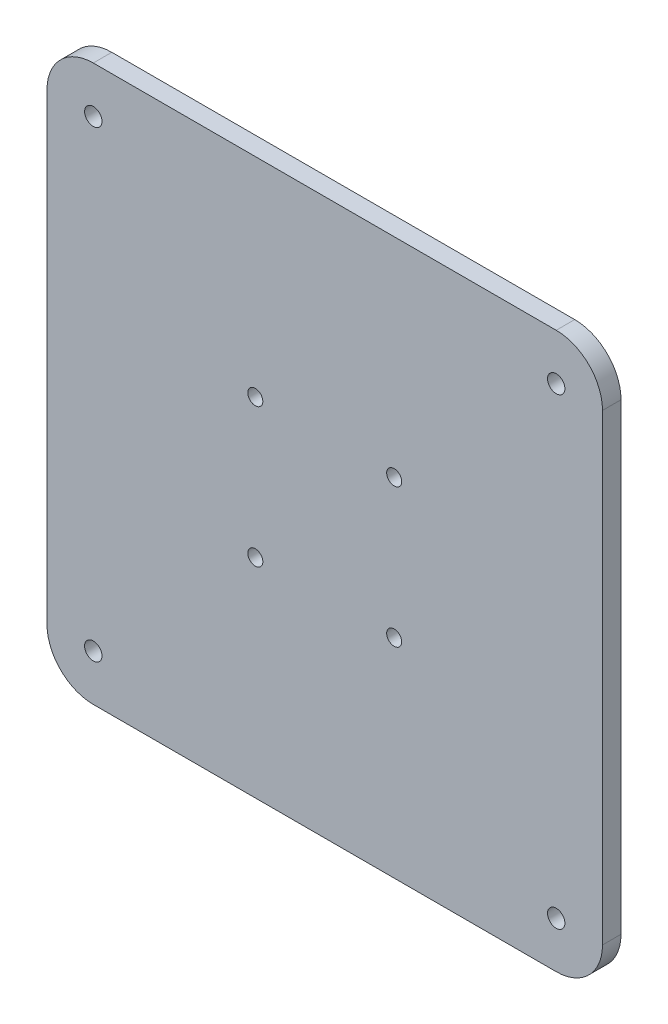
ISO-10303-21;
HEADER;
FILE_DESCRIPTION(('STEP AP214'),'2;1');
FILE_NAME('part.step','',(''),(''),'','','');
FILE_SCHEMA(('AUTOMOTIVE_DESIGN { 1 0 10303 214 1 1 1 1 }'));
ENDSEC;
DATA;
#1=APPLICATION_CONTEXT('core data for automotive mechanical design processes');
#2=APPLICATION_PROTOCOL_DEFINITION('international standard','automotive_design',2000,#1);
#3=PRODUCT_CONTEXT('',#1,'mechanical');
#4=PRODUCT('Part','Part','',(#3));
#5=PRODUCT_RELATED_PRODUCT_CATEGORY('part','',(#4));
#6=PRODUCT_DEFINITION_FORMATION('','',#4);
#7=PRODUCT_DEFINITION_CONTEXT('part definition',#1,'design');
#8=PRODUCT_DEFINITION('design','',#6,#7);
#9=PRODUCT_DEFINITION_SHAPE('','',#8);
#10=(LENGTH_UNIT() NAMED_UNIT(*) SI_UNIT(.MILLI.,.METRE.));
#11=(NAMED_UNIT(*) PLANE_ANGLE_UNIT() SI_UNIT($,.RADIAN.));
#12=(NAMED_UNIT(*) SI_UNIT($,.STERADIAN.) SOLID_ANGLE_UNIT());
#13=UNCERTAINTY_MEASURE_WITH_UNIT(LENGTH_MEASURE(1.E-05),#10,'distance_accuracy_value','');
#14=(GEOMETRIC_REPRESENTATION_CONTEXT(3) GLOBAL_UNCERTAINTY_ASSIGNED_CONTEXT((#13)) GLOBAL_UNIT_ASSIGNED_CONTEXT((#10,
#11,#12)) REPRESENTATION_CONTEXT('',''));
#15=CARTESIAN_POINT('',(0.,0.,0.));
#16=DIRECTION('',(0.,0.,1.));
#17=DIRECTION('',(1.,0.,0.));
#18=AXIS2_PLACEMENT_3D('',#15,#16,#17);
#19=CARTESIAN_POINT('',(0.,0.,8.));
#20=DIRECTION('',(0.,0.,-1.));
#21=DIRECTION('',(-1.,0.,0.));
#22=AXIS2_PLACEMENT_3D('',#19,#20,#21);
#23=PLANE('',#22);
#24=CARTESIAN_POINT('',(-100.,100.,8.));
#25=DIRECTION('',(0.,0.,-1.));
#26=DIRECTION('',(-1.,0.,0.));
#27=AXIS2_PLACEMENT_3D('',#24,#25,#26);
#28=CIRCLE('',#27,3.75000000000001);
#29=CARTESIAN_POINT('',(-103.75,100.,8.));
#30=VERTEX_POINT('',#29);
#31=EDGE_CURVE('E334',#30,#30,#28,.T.);
#32=ORIENTED_EDGE('',*,*,#31,.T.);
#33=EDGE_LOOP('',(#32));
#34=FACE_BOUND('',#33,.T.);
#35=CARTESIAN_POINT('',(100.,-100.,8.));
#36=DIRECTION('',(0.,0.,-1.));
#37=DIRECTION('',(-1.,0.,0.));
#38=AXIS2_PLACEMENT_3D('',#35,#36,#37);
#39=CIRCLE('',#38,3.75000000000001);
#40=CARTESIAN_POINT('',(96.25,-100.,8.));
#41=VERTEX_POINT('',#40);
#42=EDGE_CURVE('E322',#41,#41,#39,.T.);
#43=ORIENTED_EDGE('',*,*,#42,.T.);
#44=EDGE_LOOP('',(#43));
#45=FACE_BOUND('',#44,.T.);
#46=CARTESIAN_POINT('',(-30.,30.,8.));
#47=DIRECTION('',(0.,0.,-1.));
#48=DIRECTION('',(-1.,0.,0.));
#49=AXIS2_PLACEMENT_3D('',#46,#47,#48);
#50=CIRCLE('',#49,3.25000000000001);
#51=CARTESIAN_POINT('',(-33.25,30.,8.));
#52=VERTEX_POINT('',#51);
#53=EDGE_CURVE('E310',#52,#52,#50,.T.);
#54=ORIENTED_EDGE('',*,*,#53,.T.);
#55=EDGE_LOOP('',(#54));
#56=FACE_BOUND('',#55,.T.);
#57=CARTESIAN_POINT('',(30.,-30.,8.));
#58=DIRECTION('',(0.,0.,-1.));
#59=DIRECTION('',(-1.,0.,0.));
#60=AXIS2_PLACEMENT_3D('',#57,#58,#59);
#61=CIRCLE('',#60,3.25000000000001);
#62=CARTESIAN_POINT('',(26.75,-30.,8.));
#63=VERTEX_POINT('',#62);
#64=EDGE_CURVE('E298',#63,#63,#61,.T.);
#65=ORIENTED_EDGE('',*,*,#64,.T.);
#66=EDGE_LOOP('',(#65));
#67=FACE_BOUND('',#66,.T.);
#68=DIRECTION('',(1.,0.,0.));
#69=VECTOR('',#68,1.);
#70=CARTESIAN_POINT('',(-120.,120.,8.));
#71=LINE('',#70,#69);
#72=CARTESIAN_POINT('',(-100.,120.,8.));
#73=VERTEX_POINT('',#72);
#74=CARTESIAN_POINT('',(100.,120.,8.));
#75=VERTEX_POINT('',#74);
#76=EDGE_CURVE('E248',#73,#75,#71,.T.);
#77=ORIENTED_EDGE('',*,*,#76,.F.);
#78=CARTESIAN_POINT('',(-100.,100.,8.));
#79=DIRECTION('',(0.,0.,-1.));
#80=DIRECTION('',(-1.,0.,0.));
#81=AXIS2_PLACEMENT_3D('',#78,#79,#80);
#82=CIRCLE('',#81,20.);
#83=CARTESIAN_POINT('',(-120.,100.,8.));
#84=VERTEX_POINT('',#83);
#85=EDGE_CURVE('E272',#73,#84,#82,.F.);
#86=ORIENTED_EDGE('',*,*,#85,.T.);
#87=DIRECTION('',(0.,-1.,0.));
#88=VECTOR('',#87,1.);
#89=CARTESIAN_POINT('',(-120.,120.,8.));
#90=LINE('',#89,#88);
#91=CARTESIAN_POINT('',(-120.,-100.,8.));
#92=VERTEX_POINT('',#91);
#93=EDGE_CURVE('E241',#84,#92,#90,.T.);
#94=ORIENTED_EDGE('',*,*,#93,.T.);
#95=CARTESIAN_POINT('',(-100.,-100.,8.));
#96=DIRECTION('',(0.,0.,-1.));
#97=DIRECTION('',(-1.,0.,0.));
#98=AXIS2_PLACEMENT_3D('',#95,#96,#97);
#99=CIRCLE('',#98,20.);
#100=CARTESIAN_POINT('',(-100.,-120.,8.));
#101=VERTEX_POINT('',#100);
#102=EDGE_CURVE('E270',#92,#101,#99,.F.);
#103=ORIENTED_EDGE('',*,*,#102,.T.);
#104=DIRECTION('',(1.,0.,0.));
#105=VECTOR('',#104,1.);
#106=CARTESIAN_POINT('',(-120.,-120.,8.));
#107=LINE('',#106,#105);
#108=CARTESIAN_POINT('',(100.,-120.,8.));
#109=VERTEX_POINT('',#108);
#110=EDGE_CURVE('E283',#101,#109,#107,.T.);
#111=ORIENTED_EDGE('',*,*,#110,.T.);
#112=CARTESIAN_POINT('',(100.,-100.,8.));
#113=DIRECTION('',(0.,0.,-1.));
#114=DIRECTION('',(-1.,0.,0.));
#115=AXIS2_PLACEMENT_3D('',#112,#113,#114);
#116=CIRCLE('',#115,20.);
#117=CARTESIAN_POINT('',(120.,-100.,8.));
#118=VERTEX_POINT('',#117);
#119=EDGE_CURVE('E170',#109,#118,#116,.F.);
#120=ORIENTED_EDGE('',*,*,#119,.T.);
#121=DIRECTION('',(0.,-1.,0.));
#122=VECTOR('',#121,1.);
#123=CARTESIAN_POINT('',(120.,120.,8.));
#124=LINE('',#123,#122);
#125=CARTESIAN_POINT('',(120.,100.,8.));
#126=VERTEX_POINT('',#125);
#127=EDGE_CURVE('E252',#126,#118,#124,.T.);
#128=ORIENTED_EDGE('',*,*,#127,.F.);
#129=CARTESIAN_POINT('',(100.,100.,8.));
#130=DIRECTION('',(0.,0.,-1.));
#131=DIRECTION('',(-1.,0.,0.));
#132=AXIS2_PLACEMENT_3D('',#129,#130,#131);
#133=CIRCLE('',#132,20.);
#134=EDGE_CURVE('E267',#126,#75,#133,.F.);
#135=ORIENTED_EDGE('',*,*,#134,.T.);
#136=EDGE_LOOP('',(#77,#86,#94,#103,#111,#120,#128,#135));
#137=FACE_BOUND('',#136,.T.);
#138=CARTESIAN_POINT('',(-30.,-30.,8.));
#139=DIRECTION('',(0.,0.,1.));
#140=DIRECTION('',(1.,0.,0.));
#141=AXIS2_PLACEMENT_3D('',#138,#139,#140);
#142=CIRCLE('',#141,3.25000000000001);
#143=CARTESIAN_POINT('',(-26.75,-30.,8.));
#144=VERTEX_POINT('',#143);
#145=EDGE_CURVE('E305',#144,#144,#142,.T.);
#146=ORIENTED_EDGE('',*,*,#145,.F.);
#147=EDGE_LOOP('',(#146));
#148=FACE_BOUND('',#147,.T.);
#149=CARTESIAN_POINT('',(30.,30.,8.));
#150=DIRECTION('',(0.,0.,1.));
#151=DIRECTION('',(1.,0.,0.));
#152=AXIS2_PLACEMENT_3D('',#149,#150,#151);
#153=CIRCLE('',#152,3.25000000000001);
#154=CARTESIAN_POINT('',(33.25,30.,8.));
#155=VERTEX_POINT('',#154);
#156=EDGE_CURVE('E316',#155,#155,#153,.T.);
#157=ORIENTED_EDGE('',*,*,#156,.F.);
#158=EDGE_LOOP('',(#157));
#159=FACE_BOUND('',#158,.T.);
#160=CARTESIAN_POINT('',(-100.,-100.,8.));
#161=DIRECTION('',(0.,0.,1.));
#162=DIRECTION('',(1.,0.,0.));
#163=AXIS2_PLACEMENT_3D('',#160,#161,#162);
#164=CIRCLE('',#163,3.75000000000001);
#165=CARTESIAN_POINT('',(-96.25,-100.,8.));
#166=VERTEX_POINT('',#165);
#167=EDGE_CURVE('E328',#166,#166,#164,.T.);
#168=ORIENTED_EDGE('',*,*,#167,.F.);
#169=EDGE_LOOP('',(#168));
#170=FACE_BOUND('',#169,.T.);
#171=CARTESIAN_POINT('',(100.,100.,8.));
#172=DIRECTION('',(0.,0.,1.));
#173=DIRECTION('',(1.,0.,0.));
#174=AXIS2_PLACEMENT_3D('',#171,#172,#173);
#175=CIRCLE('',#174,3.75000000000001);
#176=CARTESIAN_POINT('',(103.75,100.,8.));
#177=VERTEX_POINT('',#176);
#178=EDGE_CURVE('E340',#177,#177,#175,.T.);
#179=ORIENTED_EDGE('',*,*,#178,.F.);
#180=EDGE_LOOP('',(#179));
#181=FACE_BOUND('',#180,.T.);
#182=ADVANCED_FACE('F155',(#34,#45,#56,#67,#137,#148,#159,#170,#181),#23,.F.);
#183=CARTESIAN_POINT('',(0.,0.,0.));
#184=DIRECTION('',(0.,0.,-1.));
#185=DIRECTION('',(-1.,0.,0.));
#186=AXIS2_PLACEMENT_3D('',#183,#184,#185);
#187=PLANE('',#186);
#188=CARTESIAN_POINT('',(-100.,-100.,0.));
#189=DIRECTION('',(0.,0.,1.));
#190=DIRECTION('',(1.,0.,0.));
#191=AXIS2_PLACEMENT_3D('',#188,#189,#190);
#192=CIRCLE('',#191,3.75000000000001);
#193=CARTESIAN_POINT('',(-96.25,-100.,0.));
#194=VERTEX_POINT('',#193);
#195=EDGE_CURVE('E331',#194,#194,#192,.T.);
#196=ORIENTED_EDGE('',*,*,#195,.T.);
#197=EDGE_LOOP('',(#196));
#198=FACE_BOUND('',#197,.T.);
#199=CARTESIAN_POINT('',(100.,-100.,0.));
#200=DIRECTION('',(0.,0.,-1.));
#201=DIRECTION('',(-1.,0.,0.));
#202=AXIS2_PLACEMENT_3D('',#199,#200,#201);
#203=CIRCLE('',#202,3.75000000000001);
#204=CARTESIAN_POINT('',(96.25,-100.,0.));
#205=VERTEX_POINT('',#204);
#206=EDGE_CURVE('E325',#205,#205,#203,.T.);
#207=ORIENTED_EDGE('',*,*,#206,.F.);
#208=EDGE_LOOP('',(#207));
#209=FACE_BOUND('',#208,.T.);
#210=CARTESIAN_POINT('',(-30.,-30.,0.));
#211=DIRECTION('',(0.,0.,1.));
#212=DIRECTION('',(1.,0.,0.));
#213=AXIS2_PLACEMENT_3D('',#210,#211,#212);
#214=CIRCLE('',#213,3.25000000000001);
#215=CARTESIAN_POINT('',(-26.75,-30.,0.));
#216=VERTEX_POINT('',#215);
#217=EDGE_CURVE('E307',#216,#216,#214,.T.);
#218=ORIENTED_EDGE('',*,*,#217,.T.);
#219=EDGE_LOOP('',(#218));
#220=FACE_BOUND('',#219,.T.);
#221=CARTESIAN_POINT('',(30.,-30.,0.));
#222=DIRECTION('',(0.,0.,-1.));
#223=DIRECTION('',(-1.,0.,0.));
#224=AXIS2_PLACEMENT_3D('',#221,#222,#223);
#225=CIRCLE('',#224,3.25000000000001);
#226=CARTESIAN_POINT('',(26.75,-30.,0.));
#227=VERTEX_POINT('',#226);
#228=EDGE_CURVE('E300',#227,#227,#225,.T.);
#229=ORIENTED_EDGE('',*,*,#228,.F.);
#230=EDGE_LOOP('',(#229));
#231=FACE_BOUND('',#230,.T.);
#232=DIRECTION('',(0.,-1.,0.));
#233=VECTOR('',#232,1.);
#234=CARTESIAN_POINT('',(-120.,120.,0.));
#235=LINE('',#234,#233);
#236=CARTESIAN_POINT('',(-120.,100.,0.));
#237=VERTEX_POINT('',#236);
#238=CARTESIAN_POINT('',(-120.,-100.,0.));
#239=VERTEX_POINT('',#238);
#240=EDGE_CURVE('E238',#237,#239,#235,.T.);
#241=ORIENTED_EDGE('',*,*,#240,.F.);
#242=CARTESIAN_POINT('',(-100.,100.,0.));
#243=DIRECTION('',(0.,0.,-1.));
#244=DIRECTION('',(-1.,0.,0.));
#245=AXIS2_PLACEMENT_3D('',#242,#243,#244);
#246=CIRCLE('',#245,20.);
#247=CARTESIAN_POINT('',(-100.,120.,0.));
#248=VERTEX_POINT('',#247);
#249=EDGE_CURVE('E221',#237,#248,#246,.T.);
#250=ORIENTED_EDGE('',*,*,#249,.T.);
#251=DIRECTION('',(1.,0.,0.));
#252=VECTOR('',#251,1.);
#253=CARTESIAN_POINT('',(-120.,120.,0.));
#254=LINE('',#253,#252);
#255=CARTESIAN_POINT('',(100.,120.,0.));
#256=VERTEX_POINT('',#255);
#257=EDGE_CURVE('E297',#248,#256,#254,.T.);
#258=ORIENTED_EDGE('',*,*,#257,.T.);
#259=CARTESIAN_POINT('',(100.,100.,0.));
#260=DIRECTION('',(0.,0.,-1.));
#261=DIRECTION('',(-1.,0.,0.));
#262=AXIS2_PLACEMENT_3D('',#259,#260,#261);
#263=CIRCLE('',#262,20.);
#264=CARTESIAN_POINT('',(120.,100.,0.));
#265=VERTEX_POINT('',#264);
#266=EDGE_CURVE('E242',#256,#265,#263,.T.);
#267=ORIENTED_EDGE('',*,*,#266,.T.);
#268=DIRECTION('',(0.,-1.,0.));
#269=VECTOR('',#268,1.);
#270=CARTESIAN_POINT('',(120.,120.,0.));
#271=LINE('',#270,#269);
#272=CARTESIAN_POINT('',(120.,-100.,0.));
#273=VERTEX_POINT('',#272);
#274=EDGE_CURVE('E255',#265,#273,#271,.T.);
#275=ORIENTED_EDGE('',*,*,#274,.T.);
#276=CARTESIAN_POINT('',(100.,-100.,0.));
#277=DIRECTION('',(0.,0.,-1.));
#278=DIRECTION('',(-1.,0.,0.));
#279=AXIS2_PLACEMENT_3D('',#276,#277,#278);
#280=CIRCLE('',#279,20.);
#281=CARTESIAN_POINT('',(100.,-120.,0.));
#282=VERTEX_POINT('',#281);
#283=EDGE_CURVE('E261',#273,#282,#280,.T.);
#284=ORIENTED_EDGE('',*,*,#283,.T.);
#285=DIRECTION('',(1.,0.,0.));
#286=VECTOR('',#285,1.);
#287=CARTESIAN_POINT('',(-120.,-120.,0.));
#288=LINE('',#287,#286);
#289=CARTESIAN_POINT('',(-100.,-120.,0.));
#290=VERTEX_POINT('',#289);
#291=EDGE_CURVE('E249',#290,#282,#288,.T.);
#292=ORIENTED_EDGE('',*,*,#291,.F.);
#293=CARTESIAN_POINT('',(-100.,-100.,0.));
#294=DIRECTION('',(0.,0.,-1.));
#295=DIRECTION('',(-1.,0.,0.));
#296=AXIS2_PLACEMENT_3D('',#293,#294,#295);
#297=CIRCLE('',#296,20.);
#298=EDGE_CURVE('E232',#290,#239,#297,.T.);
#299=ORIENTED_EDGE('',*,*,#298,.T.);
#300=EDGE_LOOP('',(#241,#250,#258,#267,#275,#284,#292,#299));
#301=FACE_BOUND('',#300,.T.);
#302=CARTESIAN_POINT('',(-30.,30.,0.));
#303=DIRECTION('',(0.,0.,-1.));
#304=DIRECTION('',(-1.,0.,0.));
#305=AXIS2_PLACEMENT_3D('',#302,#303,#304);
#306=CIRCLE('',#305,3.25000000000001);
#307=CARTESIAN_POINT('',(-33.25,30.,0.));
#308=VERTEX_POINT('',#307);
#309=EDGE_CURVE('E313',#308,#308,#306,.T.);
#310=ORIENTED_EDGE('',*,*,#309,.F.);
#311=EDGE_LOOP('',(#310));
#312=FACE_BOUND('',#311,.T.);
#313=CARTESIAN_POINT('',(30.,30.,0.));
#314=DIRECTION('',(0.,0.,1.));
#315=DIRECTION('',(1.,0.,0.));
#316=AXIS2_PLACEMENT_3D('',#313,#314,#315);
#317=CIRCLE('',#316,3.25000000000001);
#318=CARTESIAN_POINT('',(33.25,30.,0.));
#319=VERTEX_POINT('',#318);
#320=EDGE_CURVE('E319',#319,#319,#317,.T.);
#321=ORIENTED_EDGE('',*,*,#320,.T.);
#322=EDGE_LOOP('',(#321));
#323=FACE_BOUND('',#322,.T.);
#324=CARTESIAN_POINT('',(-100.,100.,0.));
#325=DIRECTION('',(0.,0.,-1.));
#326=DIRECTION('',(-1.,0.,0.));
#327=AXIS2_PLACEMENT_3D('',#324,#325,#326);
#328=CIRCLE('',#327,3.75000000000001);
#329=CARTESIAN_POINT('',(-103.75,100.,0.));
#330=VERTEX_POINT('',#329);
#331=EDGE_CURVE('E337',#330,#330,#328,.T.);
#332=ORIENTED_EDGE('',*,*,#331,.F.);
#333=EDGE_LOOP('',(#332));
#334=FACE_BOUND('',#333,.T.);
#335=CARTESIAN_POINT('',(100.,100.,0.));
#336=DIRECTION('',(0.,0.,1.));
#337=DIRECTION('',(1.,0.,0.));
#338=AXIS2_PLACEMENT_3D('',#335,#336,#337);
#339=CIRCLE('',#338,3.75000000000001);
#340=CARTESIAN_POINT('',(103.75,100.,0.));
#341=VERTEX_POINT('',#340);
#342=EDGE_CURVE('E343',#341,#341,#339,.T.);
#343=ORIENTED_EDGE('',*,*,#342,.T.);
#344=EDGE_LOOP('',(#343));
#345=FACE_BOUND('',#344,.T.);
#346=ADVANCED_FACE('F245',(#198,#209,#220,#231,#301,#312,#323,#334,#345),#187,.T.);
#347=CARTESIAN_POINT('',(-120.,120.,8.));
#348=DIRECTION('',(0.,1.,0.));
#349=DIRECTION('',(0.,0.,1.));
#350=AXIS2_PLACEMENT_3D('',#347,#348,#349);
#351=PLANE('',#350);
#352=ORIENTED_EDGE('',*,*,#257,.F.);
#353=DIRECTION('',(0.,0.,-1.));
#354=VECTOR('',#353,1.);
#355=CARTESIAN_POINT('',(-100.,120.,8.));
#356=LINE('',#355,#354);
#357=EDGE_CURVE('E226',#248,#73,#356,.F.);
#358=ORIENTED_EDGE('',*,*,#357,.T.);
#359=ORIENTED_EDGE('',*,*,#76,.T.);
#360=DIRECTION('',(0.,0.,-1.));
#361=VECTOR('',#360,1.);
#362=CARTESIAN_POINT('',(100.,120.,8.));
#363=LINE('',#362,#361);
#364=EDGE_CURVE('E231',#75,#256,#363,.T.);
#365=ORIENTED_EDGE('',*,*,#364,.T.);
#366=EDGE_LOOP('',(#352,#358,#359,#365));
#367=FACE_BOUND('',#366,.T.);
#368=ADVANCED_FACE('F358',(#367),#351,.T.);
#369=CARTESIAN_POINT('',(-120.,120.,8.));
#370=DIRECTION('',(1.,0.,0.));
#371=DIRECTION('',(0.,1.,0.));
#372=AXIS2_PLACEMENT_3D('',#369,#370,#371);
#373=PLANE('',#372);
#374=ORIENTED_EDGE('',*,*,#93,.F.);
#375=DIRECTION('',(0.,0.,-1.));
#376=VECTOR('',#375,1.);
#377=CARTESIAN_POINT('',(-120.,100.,0.));
#378=LINE('',#377,#376);
#379=EDGE_CURVE('E225',#84,#237,#378,.T.);
#380=ORIENTED_EDGE('',*,*,#379,.T.);
#381=ORIENTED_EDGE('',*,*,#240,.T.);
#382=DIRECTION('',(0.,0.,-1.));
#383=VECTOR('',#382,1.);
#384=CARTESIAN_POINT('',(-120.,-100.,8.));
#385=LINE('',#384,#383);
#386=EDGE_CURVE('E243',#239,#92,#385,.F.);
#387=ORIENTED_EDGE('',*,*,#386,.T.);
#388=EDGE_LOOP('',(#374,#380,#381,#387));
#389=FACE_BOUND('',#388,.T.);
#390=ADVANCED_FACE('F237',(#389),#373,.F.);
#391=CARTESIAN_POINT('',(-120.,-120.,8.));
#392=DIRECTION('',(0.,1.,0.));
#393=DIRECTION('',(0.,0.,1.));
#394=AXIS2_PLACEMENT_3D('',#391,#392,#393);
#395=PLANE('',#394);
#396=ORIENTED_EDGE('',*,*,#110,.F.);
#397=DIRECTION('',(0.,0.,-1.));
#398=VECTOR('',#397,1.);
#399=CARTESIAN_POINT('',(-100.,-120.,8.));
#400=LINE('',#399,#398);
#401=EDGE_CURVE('E276',#101,#290,#400,.T.);
#402=ORIENTED_EDGE('',*,*,#401,.T.);
#403=ORIENTED_EDGE('',*,*,#291,.T.);
#404=DIRECTION('',(0.,0.,-1.));
#405=VECTOR('',#404,1.);
#406=CARTESIAN_POINT('',(100.,-120.,8.));
#407=LINE('',#406,#405);
#408=EDGE_CURVE('E274',#282,#109,#407,.F.);
#409=ORIENTED_EDGE('',*,*,#408,.T.);
#410=EDGE_LOOP('',(#396,#402,#403,#409));
#411=FACE_BOUND('',#410,.T.);
#412=ADVANCED_FACE('F281',(#411),#395,.F.);
#413=CARTESIAN_POINT('',(120.,120.,8.));
#414=DIRECTION('',(1.,0.,0.));
#415=DIRECTION('',(0.,1.,0.));
#416=AXIS2_PLACEMENT_3D('',#413,#414,#415);
#417=PLANE('',#416);
#418=ORIENTED_EDGE('',*,*,#127,.T.);
#419=DIRECTION('',(0.,0.,-1.));
#420=VECTOR('',#419,1.);
#421=CARTESIAN_POINT('',(120.,-100.,0.));
#422=LINE('',#421,#420);
#423=EDGE_CURVE('E12',#118,#273,#422,.T.);
#424=ORIENTED_EDGE('',*,*,#423,.T.);
#425=ORIENTED_EDGE('',*,*,#274,.F.);
#426=DIRECTION('',(0.,0.,-1.));
#427=VECTOR('',#426,1.);
#428=CARTESIAN_POINT('',(120.,100.,8.));
#429=LINE('',#428,#427);
#430=EDGE_CURVE('E163',#265,#126,#429,.F.);
#431=ORIENTED_EDGE('',*,*,#430,.T.);
#432=EDGE_LOOP('',(#418,#424,#425,#431));
#433=FACE_BOUND('',#432,.T.);
#434=ADVANCED_FACE('F290',(#433),#417,.T.);
#435=CARTESIAN_POINT('',(30.,-30.,8.));
#436=DIRECTION('',(0.,0.,-1.));
#437=DIRECTION('',(-1.,0.,0.));
#438=AXIS2_PLACEMENT_3D('',#435,#436,#437);
#439=CYLINDRICAL_SURFACE('',#438,3.25000000000001);
#440=ORIENTED_EDGE('',*,*,#64,.F.);
#441=EDGE_LOOP('',(#440));
#442=FACE_BOUND('',#441,.T.);
#443=ORIENTED_EDGE('',*,*,#228,.T.);
#444=EDGE_LOOP('',(#443));
#445=FACE_BOUND('',#444,.T.);
#446=ADVANCED_FACE('F363',(#442,#445),#439,.F.);
#447=CARTESIAN_POINT('',(-30.,-30.,8.));
#448=DIRECTION('',(0.,0.,-1.));
#449=DIRECTION('',(-1.,0.,0.));
#450=AXIS2_PLACEMENT_3D('',#447,#448,#449);
#451=CYLINDRICAL_SURFACE('',#450,3.25000000000001);
#452=ORIENTED_EDGE('',*,*,#145,.T.);
#453=EDGE_LOOP('',(#452));
#454=FACE_BOUND('',#453,.T.);
#455=ORIENTED_EDGE('',*,*,#217,.F.);
#456=EDGE_LOOP('',(#455));
#457=FACE_BOUND('',#456,.T.);
#458=ADVANCED_FACE('F410',(#454,#457),#451,.F.);
#459=CARTESIAN_POINT('',(-30.,30.,8.));
#460=DIRECTION('',(0.,0.,-1.));
#461=DIRECTION('',(-1.,0.,0.));
#462=AXIS2_PLACEMENT_3D('',#459,#460,#461);
#463=CYLINDRICAL_SURFACE('',#462,3.25000000000001);
#464=ORIENTED_EDGE('',*,*,#53,.F.);
#465=EDGE_LOOP('',(#464));
#466=FACE_BOUND('',#465,.T.);
#467=ORIENTED_EDGE('',*,*,#309,.T.);
#468=EDGE_LOOP('',(#467));
#469=FACE_BOUND('',#468,.T.);
#470=ADVANCED_FACE('F415',(#466,#469),#463,.F.);
#471=CARTESIAN_POINT('',(30.,30.,8.));
#472=DIRECTION('',(0.,0.,-1.));
#473=DIRECTION('',(-1.,0.,0.));
#474=AXIS2_PLACEMENT_3D('',#471,#472,#473);
#475=CYLINDRICAL_SURFACE('',#474,3.25000000000001);
#476=ORIENTED_EDGE('',*,*,#156,.T.);
#477=EDGE_LOOP('',(#476));
#478=FACE_BOUND('',#477,.T.);
#479=ORIENTED_EDGE('',*,*,#320,.F.);
#480=EDGE_LOOP('',(#479));
#481=FACE_BOUND('',#480,.T.);
#482=ADVANCED_FACE('F420',(#478,#481),#475,.F.);
#483=CARTESIAN_POINT('',(100.,-100.,8.));
#484=DIRECTION('',(0.,0.,-1.));
#485=DIRECTION('',(-1.,0.,0.));
#486=AXIS2_PLACEMENT_3D('',#483,#484,#485);
#487=CYLINDRICAL_SURFACE('',#486,3.75000000000001);
#488=ORIENTED_EDGE('',*,*,#42,.F.);
#489=EDGE_LOOP('',(#488));
#490=FACE_BOUND('',#489,.T.);
#491=ORIENTED_EDGE('',*,*,#206,.T.);
#492=EDGE_LOOP('',(#491));
#493=FACE_BOUND('',#492,.T.);
#494=ADVANCED_FACE('F399',(#490,#493),#487,.F.);
#495=CARTESIAN_POINT('',(-100.,-100.,8.));
#496=DIRECTION('',(0.,0.,-1.));
#497=DIRECTION('',(-1.,0.,0.));
#498=AXIS2_PLACEMENT_3D('',#495,#496,#497);
#499=CYLINDRICAL_SURFACE('',#498,3.75000000000001);
#500=ORIENTED_EDGE('',*,*,#167,.T.);
#501=EDGE_LOOP('',(#500));
#502=FACE_BOUND('',#501,.T.);
#503=ORIENTED_EDGE('',*,*,#195,.F.);
#504=EDGE_LOOP('',(#503));
#505=FACE_BOUND('',#504,.T.);
#506=ADVANCED_FACE('F395',(#502,#505),#499,.F.);
#507=CARTESIAN_POINT('',(-100.,100.,8.));
#508=DIRECTION('',(0.,0.,-1.));
#509=DIRECTION('',(-1.,0.,0.));
#510=AXIS2_PLACEMENT_3D('',#507,#508,#509);
#511=CYLINDRICAL_SURFACE('',#510,3.75000000000001);
#512=ORIENTED_EDGE('',*,*,#31,.F.);
#513=EDGE_LOOP('',(#512));
#514=FACE_BOUND('',#513,.T.);
#515=ORIENTED_EDGE('',*,*,#331,.T.);
#516=EDGE_LOOP('',(#515));
#517=FACE_BOUND('',#516,.T.);
#518=ADVANCED_FACE('F398',(#514,#517),#511,.F.);
#519=CARTESIAN_POINT('',(100.,100.,8.));
#520=DIRECTION('',(0.,0.,-1.));
#521=DIRECTION('',(-1.,0.,0.));
#522=AXIS2_PLACEMENT_3D('',#519,#520,#521);
#523=CYLINDRICAL_SURFACE('',#522,3.75000000000001);
#524=ORIENTED_EDGE('',*,*,#178,.T.);
#525=EDGE_LOOP('',(#524));
#526=FACE_BOUND('',#525,.T.);
#527=ORIENTED_EDGE('',*,*,#342,.F.);
#528=EDGE_LOOP('',(#527));
#529=FACE_BOUND('',#528,.T.);
#530=ADVANCED_FACE('F349',(#526,#529),#523,.F.);
#531=CARTESIAN_POINT('',(-100.,100.,8.));
#532=DIRECTION('',(0.,0.,1.));
#533=DIRECTION('',(1.,0.,0.));
#534=AXIS2_PLACEMENT_3D('',#531,#532,#533);
#535=CYLINDRICAL_SURFACE('',#534,20.);
#536=ORIENTED_EDGE('',*,*,#85,.F.);
#537=ORIENTED_EDGE('',*,*,#357,.F.);
#538=ORIENTED_EDGE('',*,*,#249,.F.);
#539=ORIENTED_EDGE('',*,*,#379,.F.);
#540=EDGE_LOOP('',(#536,#537,#538,#539));
#541=FACE_BOUND('',#540,.T.);
#542=ADVANCED_FACE('F224',(#541),#535,.T.);
#543=CARTESIAN_POINT('',(-100.,-100.,8.));
#544=DIRECTION('',(0.,0.,-1.));
#545=DIRECTION('',(-1.,0.,0.));
#546=AXIS2_PLACEMENT_3D('',#543,#544,#545);
#547=CYLINDRICAL_SURFACE('',#546,20.);
#548=ORIENTED_EDGE('',*,*,#102,.F.);
#549=ORIENTED_EDGE('',*,*,#386,.F.);
#550=ORIENTED_EDGE('',*,*,#298,.F.);
#551=ORIENTED_EDGE('',*,*,#401,.F.);
#552=EDGE_LOOP('',(#548,#549,#550,#551));
#553=FACE_BOUND('',#552,.T.);
#554=ADVANCED_FACE('F377',(#553),#547,.T.);
#555=CARTESIAN_POINT('',(100.,-100.,8.));
#556=DIRECTION('',(0.,0.,1.));
#557=DIRECTION('',(1.,0.,0.));
#558=AXIS2_PLACEMENT_3D('',#555,#556,#557);
#559=CYLINDRICAL_SURFACE('',#558,20.);
#560=ORIENTED_EDGE('',*,*,#119,.F.);
#561=ORIENTED_EDGE('',*,*,#408,.F.);
#562=ORIENTED_EDGE('',*,*,#283,.F.);
#563=ORIENTED_EDGE('',*,*,#423,.F.);
#564=EDGE_LOOP('',(#560,#561,#562,#563));
#565=FACE_BOUND('',#564,.T.);
#566=ADVANCED_FACE('F289',(#565),#559,.T.);
#567=CARTESIAN_POINT('',(100.,100.,8.));
#568=DIRECTION('',(0.,0.,-1.));
#569=DIRECTION('',(-1.,0.,0.));
#570=AXIS2_PLACEMENT_3D('',#567,#568,#569);
#571=CYLINDRICAL_SURFACE('',#570,20.);
#572=ORIENTED_EDGE('',*,*,#134,.F.);
#573=ORIENTED_EDGE('',*,*,#430,.F.);
#574=ORIENTED_EDGE('',*,*,#266,.F.);
#575=ORIENTED_EDGE('',*,*,#364,.F.);
#576=EDGE_LOOP('',(#572,#573,#574,#575));
#577=FACE_BOUND('',#576,.T.);
#578=ADVANCED_FACE('F157',(#577),#571,.T.);
#579=CLOSED_SHELL('',(#182,#346,#368,#390,#412,#434,#446,#458,#470,#482,#494,#506,#518,#530,
#542,#554,#566,#578));
#580=MANIFOLD_SOLID_BREP('B2',#579);
#581=ADVANCED_BREP_SHAPE_REPRESENTATION('',(#18,#580),#14);
#582=SHAPE_DEFINITION_REPRESENTATION(#9,#581);
ENDSEC;
END-ISO-10303-21;
